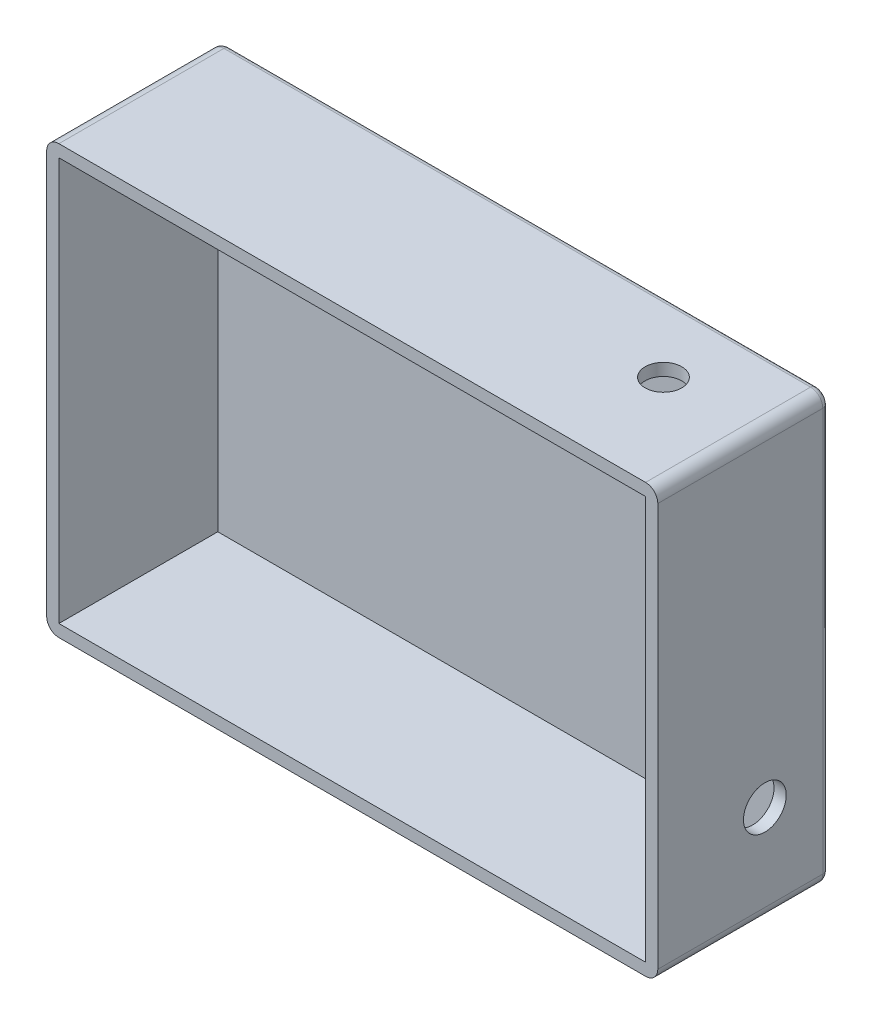
ISO-10303-21;
HEADER;
FILE_DESCRIPTION(('STEP AP214'),'2;1');
FILE_NAME('part.step','',(''),(''),'','','');
FILE_SCHEMA(('AUTOMOTIVE_DESIGN { 1 0 10303 214 1 1 1 1 }'));
ENDSEC;
DATA;
#1=APPLICATION_CONTEXT('core data for automotive mechanical design processes');
#2=APPLICATION_PROTOCOL_DEFINITION('international standard','automotive_design',2000,#1);
#3=PRODUCT_CONTEXT('',#1,'mechanical');
#4=PRODUCT('Part','Part','',(#3));
#5=PRODUCT_RELATED_PRODUCT_CATEGORY('part','',(#4));
#6=PRODUCT_DEFINITION_FORMATION('','',#4);
#7=PRODUCT_DEFINITION_CONTEXT('part definition',#1,'design');
#8=PRODUCT_DEFINITION('design','',#6,#7);
#9=PRODUCT_DEFINITION_SHAPE('','',#8);
#10=(LENGTH_UNIT() NAMED_UNIT(*) SI_UNIT(.MILLI.,.METRE.));
#11=(NAMED_UNIT(*) PLANE_ANGLE_UNIT() SI_UNIT($,.RADIAN.));
#12=(NAMED_UNIT(*) SI_UNIT($,.STERADIAN.) SOLID_ANGLE_UNIT());
#13=UNCERTAINTY_MEASURE_WITH_UNIT(LENGTH_MEASURE(1.E-05),#10,'distance_accuracy_value','');
#14=(GEOMETRIC_REPRESENTATION_CONTEXT(3) GLOBAL_UNCERTAINTY_ASSIGNED_CONTEXT((#13)) GLOBAL_UNIT_ASSIGNED_CONTEXT((#10,
#11,#12)) REPRESENTATION_CONTEXT('',''));
#15=CARTESIAN_POINT('',(0.,0.,0.));
#16=DIRECTION('',(0.,0.,1.));
#17=DIRECTION('',(1.,0.,0.));
#18=AXIS2_PLACEMENT_3D('',#15,#16,#17);
#19=CARTESIAN_POINT('',(250.,175.,140.));
#20=DIRECTION('',(-1.,0.,0.));
#21=DIRECTION('',(0.,-1.,0.));
#22=AXIS2_PLACEMENT_3D('',#19,#20,#21);
#23=PLANE('',#22);
#24=CARTESIAN_POINT('',(250.,-94.1040003709782,52.4033170038006));
#25=DIRECTION('',(1.,0.,0.));
#26=DIRECTION('',(0.,1.,0.));
#27=AXIS2_PLACEMENT_3D('',#24,#25,#26);
#28=CIRCLE('',#27,17.5);
#29=CARTESIAN_POINT('',(250.,-76.6040003709782,52.4033170038006));
#30=VERTEX_POINT('',#29);
#31=EDGE_CURVE('E202',#30,#30,#28,.T.);
#32=ORIENTED_EDGE('',*,*,#31,.F.);
#33=EDGE_LOOP('',(#32));
#34=FACE_BOUND('',#33,.T.);
#35=DIRECTION('',(0.,0.,-1.));
#36=VECTOR('',#35,1.);
#37=CARTESIAN_POINT('',(250.,-165.,140.));
#38=LINE('',#37,#36);
#39=CARTESIAN_POINT('',(250.,-165.,140.));
#40=VERTEX_POINT('',#39);
#41=CARTESIAN_POINT('',(250.,-165.,5.));
#42=VERTEX_POINT('',#41);
#43=EDGE_CURVE('E221',#40,#42,#38,.T.);
#44=ORIENTED_EDGE('',*,*,#43,.T.);
#45=DIRECTION('',(0.,1.,0.));
#46=VECTOR('',#45,1.);
#47=CARTESIAN_POINT('',(250.,175.,5.));
#48=LINE('',#47,#46);
#49=CARTESIAN_POINT('',(250.,165.,5.));
#50=VERTEX_POINT('',#49);
#51=EDGE_CURVE('E263',#42,#50,#48,.T.);
#52=ORIENTED_EDGE('',*,*,#51,.T.);
#53=DIRECTION('',(0.,0.,-1.));
#54=VECTOR('',#53,1.);
#55=CARTESIAN_POINT('',(250.,165.,140.));
#56=LINE('',#55,#54);
#57=CARTESIAN_POINT('',(250.,165.,140.));
#58=VERTEX_POINT('',#57);
#59=EDGE_CURVE('E224',#50,#58,#56,.F.);
#60=ORIENTED_EDGE('',*,*,#59,.T.);
#61=DIRECTION('',(0.,1.,0.));
#62=VECTOR('',#61,1.);
#63=CARTESIAN_POINT('',(250.,175.,140.));
#64=LINE('',#63,#62);
#65=EDGE_CURVE('E205',#40,#58,#64,.T.);
#66=ORIENTED_EDGE('',*,*,#65,.F.);
#67=EDGE_LOOP('',(#44,#52,#60,#66));
#68=FACE_BOUND('',#67,.T.);
#69=ADVANCED_FACE('F35',(#34,#68),#23,.F.);
#70=CARTESIAN_POINT('',(-250.,175.,140.));
#71=DIRECTION('',(0.,-1.,0.));
#72=DIRECTION('',(0.,0.,-1.));
#73=AXIS2_PLACEMENT_3D('',#70,#71,#72);
#74=PLANE('',#73);
#75=CARTESIAN_POINT('',(172.86422889253,175.,58.2460868735127));
#76=DIRECTION('',(0.,1.,0.));
#77=DIRECTION('',(0.,0.,1.));
#78=AXIS2_PLACEMENT_3D('',#75,#76,#77);
#79=CIRCLE('',#78,15.);
#80=CARTESIAN_POINT('',(172.86422889253,175.,73.2460868735127));
#81=VERTEX_POINT('',#80);
#82=EDGE_CURVE('E199',#81,#81,#79,.T.);
#83=ORIENTED_EDGE('',*,*,#82,.F.);
#84=EDGE_LOOP('',(#83));
#85=FACE_BOUND('',#84,.T.);
#86=DIRECTION('',(0.,0.,-1.));
#87=VECTOR('',#86,1.);
#88=CARTESIAN_POINT('',(240.,175.,140.));
#89=LINE('',#88,#87);
#90=CARTESIAN_POINT('',(240.,175.,140.));
#91=VERTEX_POINT('',#90);
#92=CARTESIAN_POINT('',(240.,175.,5.));
#93=VERTEX_POINT('',#92);
#94=EDGE_CURVE('E219',#91,#93,#89,.T.);
#95=ORIENTED_EDGE('',*,*,#94,.T.);
#96=DIRECTION('',(-1.,0.,0.));
#97=VECTOR('',#96,1.);
#98=CARTESIAN_POINT('',(-250.,175.,5.));
#99=LINE('',#98,#97);
#100=CARTESIAN_POINT('',(-240.,175.,5.));
#101=VERTEX_POINT('',#100);
#102=EDGE_CURVE('E11',#93,#101,#99,.T.);
#103=ORIENTED_EDGE('',*,*,#102,.T.);
#104=DIRECTION('',(0.,0.,-1.));
#105=VECTOR('',#104,1.);
#106=CARTESIAN_POINT('',(-240.,175.,140.));
#107=LINE('',#106,#105);
#108=CARTESIAN_POINT('',(-240.,175.,140.));
#109=VERTEX_POINT('',#108);
#110=EDGE_CURVE('E217',#101,#109,#107,.F.);
#111=ORIENTED_EDGE('',*,*,#110,.T.);
#112=DIRECTION('',(-1.,0.,0.));
#113=VECTOR('',#112,1.);
#114=CARTESIAN_POINT('',(-250.,175.,140.));
#115=LINE('',#114,#113);
#116=EDGE_CURVE('E208',#91,#109,#115,.T.);
#117=ORIENTED_EDGE('',*,*,#116,.F.);
#118=EDGE_LOOP('',(#95,#103,#111,#117));
#119=FACE_BOUND('',#118,.T.);
#120=ADVANCED_FACE('F344',(#85,#119),#74,.F.);
#121=CARTESIAN_POINT('',(-250.,175.,140.));
#122=DIRECTION('',(1.,0.,0.));
#123=DIRECTION('',(0.,0.,-1.));
#124=AXIS2_PLACEMENT_3D('',#121,#122,#123);
#125=PLANE('',#124);
#126=DIRECTION('',(0.,0.,-1.));
#127=VECTOR('',#126,1.);
#128=CARTESIAN_POINT('',(-250.,165.,140.));
#129=LINE('',#128,#127);
#130=CARTESIAN_POINT('',(-250.,165.,140.));
#131=VERTEX_POINT('',#130);
#132=CARTESIAN_POINT('',(-250.,165.,5.));
#133=VERTEX_POINT('',#132);
#134=EDGE_CURVE('E241',#131,#133,#129,.T.);
#135=ORIENTED_EDGE('',*,*,#134,.T.);
#136=DIRECTION('',(0.,-1.,0.));
#137=VECTOR('',#136,1.);
#138=CARTESIAN_POINT('',(-250.,175.,5.));
#139=LINE('',#138,#137);
#140=CARTESIAN_POINT('',(-250.,-165.,5.));
#141=VERTEX_POINT('',#140);
#142=EDGE_CURVE('E271',#133,#141,#139,.T.);
#143=ORIENTED_EDGE('',*,*,#142,.T.);
#144=DIRECTION('',(0.,0.,-1.));
#145=VECTOR('',#144,1.);
#146=CARTESIAN_POINT('',(-250.,-165.,140.));
#147=LINE('',#146,#145);
#148=CARTESIAN_POINT('',(-250.,-165.,140.));
#149=VERTEX_POINT('',#148);
#150=EDGE_CURVE('E239',#141,#149,#147,.F.);
#151=ORIENTED_EDGE('',*,*,#150,.T.);
#152=DIRECTION('',(0.,-1.,0.));
#153=VECTOR('',#152,1.);
#154=CARTESIAN_POINT('',(-250.,175.,140.));
#155=LINE('',#154,#153);
#156=EDGE_CURVE('E211',#131,#149,#155,.T.);
#157=ORIENTED_EDGE('',*,*,#156,.F.);
#158=EDGE_LOOP('',(#135,#143,#151,#157));
#159=FACE_BOUND('',#158,.T.);
#160=ADVANCED_FACE('F349',(#159),#125,.F.);
#161=CARTESIAN_POINT('',(-250.,-175.,140.));
#162=DIRECTION('',(0.,1.,0.));
#163=DIRECTION('',(0.,0.,1.));
#164=AXIS2_PLACEMENT_3D('',#161,#162,#163);
#165=PLANE('',#164);
#166=DIRECTION('',(0.,0.,-1.));
#167=VECTOR('',#166,1.);
#168=CARTESIAN_POINT('',(-240.,-175.,140.));
#169=LINE('',#168,#167);
#170=CARTESIAN_POINT('',(-240.,-175.,140.));
#171=VERTEX_POINT('',#170);
#172=CARTESIAN_POINT('',(-240.,-175.,5.));
#173=VERTEX_POINT('',#172);
#174=EDGE_CURVE('E234',#171,#173,#169,.T.);
#175=ORIENTED_EDGE('',*,*,#174,.T.);
#176=DIRECTION('',(1.,0.,0.));
#177=VECTOR('',#176,1.);
#178=CARTESIAN_POINT('',(-250.,-175.,5.));
#179=LINE('',#178,#177);
#180=CARTESIAN_POINT('',(240.,-175.,5.));
#181=VERTEX_POINT('',#180);
#182=EDGE_CURVE('E267',#173,#181,#179,.T.);
#183=ORIENTED_EDGE('',*,*,#182,.T.);
#184=DIRECTION('',(0.,0.,-1.));
#185=VECTOR('',#184,1.);
#186=CARTESIAN_POINT('',(240.,-175.,140.));
#187=LINE('',#186,#185);
#188=CARTESIAN_POINT('',(240.,-175.,140.));
#189=VERTEX_POINT('',#188);
#190=EDGE_CURVE('E237',#181,#189,#187,.F.);
#191=ORIENTED_EDGE('',*,*,#190,.T.);
#192=DIRECTION('',(1.,0.,0.));
#193=VECTOR('',#192,1.);
#194=CARTESIAN_POINT('',(-250.,-175.,140.));
#195=LINE('',#194,#193);
#196=EDGE_CURVE('E214',#171,#189,#195,.T.);
#197=ORIENTED_EDGE('',*,*,#196,.F.);
#198=EDGE_LOOP('',(#175,#183,#191,#197));
#199=FACE_BOUND('',#198,.T.);
#200=ADVANCED_FACE('F312',(#199),#165,.F.);
#201=CARTESIAN_POINT('',(0.,0.,140.));
#202=DIRECTION('',(0.,0.,1.));
#203=DIRECTION('',(1.,0.,0.));
#204=AXIS2_PLACEMENT_3D('',#201,#202,#203);
#205=PLANE('',#204);
#206=DIRECTION('',(0.,1.,0.));
#207=VECTOR('',#206,1.);
#208=CARTESIAN_POINT('',(240.,165.,140.));
#209=LINE('',#208,#207);
#210=CARTESIAN_POINT('',(240.,-165.,140.));
#211=VERTEX_POINT('',#210);
#212=CARTESIAN_POINT('',(240.,165.,140.));
#213=VERTEX_POINT('',#212);
#214=EDGE_CURVE('E157',#211,#213,#209,.T.);
#215=ORIENTED_EDGE('',*,*,#214,.F.);
#216=DIRECTION('',(1.,0.,0.));
#217=VECTOR('',#216,1.);
#218=CARTESIAN_POINT('',(-240.,-165.,140.));
#219=LINE('',#218,#217);
#220=CARTESIAN_POINT('',(-240.,-165.,140.));
#221=VERTEX_POINT('',#220);
#222=EDGE_CURVE('E175',#221,#211,#219,.T.);
#223=ORIENTED_EDGE('',*,*,#222,.F.);
#224=DIRECTION('',(0.,-1.,0.));
#225=VECTOR('',#224,1.);
#226=CARTESIAN_POINT('',(-240.,165.,140.));
#227=LINE('',#226,#225);
#228=CARTESIAN_POINT('',(-240.,165.,140.));
#229=VERTEX_POINT('',#228);
#230=EDGE_CURVE('E178',#229,#221,#227,.T.);
#231=ORIENTED_EDGE('',*,*,#230,.F.);
#232=DIRECTION('',(-1.,0.,0.));
#233=VECTOR('',#232,1.);
#234=CARTESIAN_POINT('',(-240.,165.,140.));
#235=LINE('',#234,#233);
#236=EDGE_CURVE('E184',#213,#229,#235,.T.);
#237=ORIENTED_EDGE('',*,*,#236,.F.);
#238=EDGE_LOOP('',(#215,#223,#231,#237));
#239=FACE_BOUND('',#238,.T.);
#240=ORIENTED_EDGE('',*,*,#65,.T.);
#241=CARTESIAN_POINT('',(240.,165.,140.));
#242=DIRECTION('',(0.,0.,1.));
#243=DIRECTION('',(1.,0.,0.));
#244=AXIS2_PLACEMENT_3D('',#241,#242,#243);
#245=CIRCLE('',#244,10.);
#246=EDGE_CURVE('E232',#58,#91,#245,.T.);
#247=ORIENTED_EDGE('',*,*,#246,.T.);
#248=ORIENTED_EDGE('',*,*,#116,.T.);
#249=CARTESIAN_POINT('',(-240.,165.,140.));
#250=DIRECTION('',(0.,0.,1.));
#251=DIRECTION('',(1.,0.,0.));
#252=AXIS2_PLACEMENT_3D('',#249,#250,#251);
#253=CIRCLE('',#252,10.);
#254=EDGE_CURVE('E228',#109,#131,#253,.T.);
#255=ORIENTED_EDGE('',*,*,#254,.T.);
#256=ORIENTED_EDGE('',*,*,#156,.T.);
#257=CARTESIAN_POINT('',(-240.,-165.,140.));
#258=DIRECTION('',(0.,0.,1.));
#259=DIRECTION('',(1.,0.,0.));
#260=AXIS2_PLACEMENT_3D('',#257,#258,#259);
#261=CIRCLE('',#260,10.);
#262=EDGE_CURVE('E226',#149,#171,#261,.T.);
#263=ORIENTED_EDGE('',*,*,#262,.T.);
#264=ORIENTED_EDGE('',*,*,#196,.T.);
#265=CARTESIAN_POINT('',(240.,-165.,140.));
#266=DIRECTION('',(0.,0.,1.));
#267=DIRECTION('',(1.,0.,0.));
#268=AXIS2_PLACEMENT_3D('',#265,#266,#267);
#269=CIRCLE('',#268,10.);
#270=EDGE_CURVE('E230',#189,#40,#269,.T.);
#271=ORIENTED_EDGE('',*,*,#270,.T.);
#272=EDGE_LOOP('',(#240,#247,#248,#255,#256,#263,#264,#271));
#273=FACE_BOUND('',#272,.T.);
#274=ADVANCED_FACE('F316',(#239,#273),#205,.T.);
#275=CARTESIAN_POINT('',(0.,0.,0.));
#276=DIRECTION('',(0.,0.,1.));
#277=DIRECTION('',(1.,0.,0.));
#278=AXIS2_PLACEMENT_3D('',#275,#276,#277);
#279=PLANE('',#278);
#280=DIRECTION('',(-1.,0.,0.));
#281=VECTOR('',#280,1.);
#282=CARTESIAN_POINT('',(0.,170.,0.));
#283=LINE('',#282,#281);
#284=CARTESIAN_POINT('',(-240.,170.,0.));
#285=VERTEX_POINT('',#284);
#286=CARTESIAN_POINT('',(240.,170.,0.));
#287=VERTEX_POINT('',#286);
#288=EDGE_CURVE('E243',#285,#287,#283,.F.);
#289=ORIENTED_EDGE('',*,*,#288,.T.);
#290=CARTESIAN_POINT('',(240.,165.,0.));
#291=DIRECTION('',(0.,0.,1.));
#292=DIRECTION('',(1.,0.,0.));
#293=AXIS2_PLACEMENT_3D('',#290,#291,#292);
#294=CIRCLE('',#293,5.);
#295=CARTESIAN_POINT('',(245.,165.,0.));
#296=VERTEX_POINT('',#295);
#297=EDGE_CURVE('E257',#287,#296,#294,.F.);
#298=ORIENTED_EDGE('',*,*,#297,.T.);
#299=DIRECTION('',(0.,1.,0.));
#300=VECTOR('',#299,1.);
#301=CARTESIAN_POINT('',(245.,0.,0.));
#302=LINE('',#301,#300);
#303=CARTESIAN_POINT('',(245.,-165.,0.));
#304=VERTEX_POINT('',#303);
#305=EDGE_CURVE('E255',#296,#304,#302,.F.);
#306=ORIENTED_EDGE('',*,*,#305,.T.);
#307=CARTESIAN_POINT('',(240.,-165.,0.));
#308=DIRECTION('',(0.,0.,1.));
#309=DIRECTION('',(1.,0.,0.));
#310=AXIS2_PLACEMENT_3D('',#307,#308,#309);
#311=CIRCLE('',#310,5.);
#312=CARTESIAN_POINT('',(240.,-170.,0.));
#313=VERTEX_POINT('',#312);
#314=EDGE_CURVE('E253',#304,#313,#311,.F.);
#315=ORIENTED_EDGE('',*,*,#314,.T.);
#316=DIRECTION('',(1.,0.,0.));
#317=VECTOR('',#316,1.);
#318=CARTESIAN_POINT('',(0.,-170.,0.));
#319=LINE('',#318,#317);
#320=CARTESIAN_POINT('',(-240.,-170.,0.));
#321=VERTEX_POINT('',#320);
#322=EDGE_CURVE('E251',#313,#321,#319,.F.);
#323=ORIENTED_EDGE('',*,*,#322,.T.);
#324=CARTESIAN_POINT('',(-240.,-165.,0.));
#325=DIRECTION('',(0.,0.,1.));
#326=DIRECTION('',(1.,0.,0.));
#327=AXIS2_PLACEMENT_3D('',#324,#325,#326);
#328=CIRCLE('',#327,5.);
#329=CARTESIAN_POINT('',(-245.,-165.,0.));
#330=VERTEX_POINT('',#329);
#331=EDGE_CURVE('E249',#321,#330,#328,.F.);
#332=ORIENTED_EDGE('',*,*,#331,.T.);
#333=DIRECTION('',(0.,-1.,0.));
#334=VECTOR('',#333,1.);
#335=CARTESIAN_POINT('',(-245.,0.,0.));
#336=LINE('',#335,#334);
#337=CARTESIAN_POINT('',(-245.,165.,0.));
#338=VERTEX_POINT('',#337);
#339=EDGE_CURVE('E247',#330,#338,#336,.F.);
#340=ORIENTED_EDGE('',*,*,#339,.T.);
#341=CARTESIAN_POINT('',(-240.,165.,0.));
#342=DIRECTION('',(0.,0.,1.));
#343=DIRECTION('',(1.,0.,0.));
#344=AXIS2_PLACEMENT_3D('',#341,#342,#343);
#345=CIRCLE('',#344,5.);
#346=EDGE_CURVE('E245',#338,#285,#345,.F.);
#347=ORIENTED_EDGE('',*,*,#346,.T.);
#348=EDGE_LOOP('',(#289,#298,#306,#315,#323,#332,#340,#347));
#349=FACE_BOUND('',#348,.T.);
#350=ADVANCED_FACE('F463',(#349),#279,.F.);
#351=CARTESIAN_POINT('',(240.,-94.1040003709782,52.4033170038006));
#352=DIRECTION('',(1.,0.,0.));
#353=DIRECTION('',(0.,1.,0.));
#354=AXIS2_PLACEMENT_3D('',#351,#352,#353);
#355=CYLINDRICAL_SURFACE('',#354,17.5);
#356=CARTESIAN_POINT('',(240.,-94.1040003709782,52.4033170038006));
#357=DIRECTION('',(1.,0.,0.));
#358=DIRECTION('',(0.,0.,-1.));
#359=AXIS2_PLACEMENT_3D('',#356,#357,#358);
#360=CIRCLE('',#359,17.5);
#361=CARTESIAN_POINT('',(240.,-94.1040003709782,34.9033170038006));
#362=VERTEX_POINT('',#361);
#363=EDGE_CURVE('E196',#362,#362,#360,.F.);
#364=ORIENTED_EDGE('',*,*,#363,.T.);
#365=EDGE_LOOP('',(#364));
#366=FACE_BOUND('',#365,.T.);
#367=ORIENTED_EDGE('',*,*,#31,.T.);
#368=EDGE_LOOP('',(#367));
#369=FACE_BOUND('',#368,.T.);
#370=ADVANCED_FACE('F455',(#366,#369),#355,.F.);
#371=CARTESIAN_POINT('',(172.86422889253,165.,58.2460868735127));
#372=DIRECTION('',(0.,1.,0.));
#373=DIRECTION('',(0.,0.,1.));
#374=AXIS2_PLACEMENT_3D('',#371,#372,#373);
#375=CYLINDRICAL_SURFACE('',#374,15.);
#376=CARTESIAN_POINT('',(172.86422889253,165.,58.2460868735127));
#377=DIRECTION('',(0.,1.,0.));
#378=DIRECTION('',(0.,0.,1.));
#379=AXIS2_PLACEMENT_3D('',#376,#377,#378);
#380=CIRCLE('',#379,15.);
#381=CARTESIAN_POINT('',(172.86422889253,165.,73.2460868735127));
#382=VERTEX_POINT('',#381);
#383=EDGE_CURVE('E190',#382,#382,#380,.F.);
#384=ORIENTED_EDGE('',*,*,#383,.T.);
#385=EDGE_LOOP('',(#384));
#386=FACE_BOUND('',#385,.T.);
#387=ORIENTED_EDGE('',*,*,#82,.T.);
#388=EDGE_LOOP('',(#387));
#389=FACE_BOUND('',#388,.T.);
#390=ADVANCED_FACE('F448',(#386,#389),#375,.F.);
#391=CARTESIAN_POINT('',(240.,165.,10.));
#392=DIRECTION('',(1.,0.,0.));
#393=DIRECTION('',(0.,0.,-1.));
#394=AXIS2_PLACEMENT_3D('',#391,#392,#393);
#395=PLANE('',#394);
#396=ORIENTED_EDGE('',*,*,#214,.T.);
#397=DIRECTION('',(0.,0.,1.));
#398=VECTOR('',#397,1.);
#399=CARTESIAN_POINT('',(240.,165.,10.));
#400=LINE('',#399,#398);
#401=CARTESIAN_POINT('',(240.,165.,10.));
#402=VERTEX_POINT('',#401);
#403=EDGE_CURVE('E149',#402,#213,#400,.T.);
#404=ORIENTED_EDGE('',*,*,#403,.F.);
#405=DIRECTION('',(0.,1.,0.));
#406=VECTOR('',#405,1.);
#407=CARTESIAN_POINT('',(240.,165.,10.));
#408=LINE('',#407,#406);
#409=CARTESIAN_POINT('',(240.,-165.,10.));
#410=VERTEX_POINT('',#409);
#411=EDGE_CURVE('E154',#410,#402,#408,.T.);
#412=ORIENTED_EDGE('',*,*,#411,.F.);
#413=DIRECTION('',(0.,0.,1.));
#414=VECTOR('',#413,1.);
#415=CARTESIAN_POINT('',(240.,-165.,10.));
#416=LINE('',#415,#414);
#417=EDGE_CURVE('E188',#410,#211,#416,.T.);
#418=ORIENTED_EDGE('',*,*,#417,.T.);
#419=EDGE_LOOP('',(#396,#404,#412,#418));
#420=FACE_BOUND('',#419,.T.);
#421=ORIENTED_EDGE('',*,*,#363,.F.);
#422=EDGE_LOOP('',(#421));
#423=FACE_BOUND('',#422,.T.);
#424=ADVANCED_FACE('F151',(#420,#423),#395,.F.);
#425=CARTESIAN_POINT('',(-240.,165.,10.));
#426=DIRECTION('',(0.,1.,0.));
#427=DIRECTION('',(0.,0.,1.));
#428=AXIS2_PLACEMENT_3D('',#425,#426,#427);
#429=PLANE('',#428);
#430=ORIENTED_EDGE('',*,*,#236,.T.);
#431=DIRECTION('',(0.,0.,1.));
#432=VECTOR('',#431,1.);
#433=CARTESIAN_POINT('',(-240.,165.,10.));
#434=LINE('',#433,#432);
#435=CARTESIAN_POINT('',(-240.,165.,10.));
#436=VERTEX_POINT('',#435);
#437=EDGE_CURVE('E161',#436,#229,#434,.T.);
#438=ORIENTED_EDGE('',*,*,#437,.F.);
#439=DIRECTION('',(-1.,0.,0.));
#440=VECTOR('',#439,1.);
#441=CARTESIAN_POINT('',(-240.,165.,10.));
#442=LINE('',#441,#440);
#443=EDGE_CURVE('E165',#402,#436,#442,.T.);
#444=ORIENTED_EDGE('',*,*,#443,.F.);
#445=ORIENTED_EDGE('',*,*,#403,.T.);
#446=EDGE_LOOP('',(#430,#438,#444,#445));
#447=FACE_BOUND('',#446,.T.);
#448=ORIENTED_EDGE('',*,*,#383,.F.);
#449=EDGE_LOOP('',(#448));
#450=FACE_BOUND('',#449,.T.);
#451=ADVANCED_FACE('F166',(#447,#450),#429,.F.);
#452=CARTESIAN_POINT('',(-240.,-165.,10.));
#453=DIRECTION('',(0.,-1.,0.));
#454=DIRECTION('',(0.,0.,-1.));
#455=AXIS2_PLACEMENT_3D('',#452,#453,#454);
#456=PLANE('',#455);
#457=ORIENTED_EDGE('',*,*,#222,.T.);
#458=ORIENTED_EDGE('',*,*,#417,.F.);
#459=DIRECTION('',(1.,0.,0.));
#460=VECTOR('',#459,1.);
#461=CARTESIAN_POINT('',(-240.,-165.,10.));
#462=LINE('',#461,#460);
#463=CARTESIAN_POINT('',(-240.,-165.,10.));
#464=VERTEX_POINT('',#463);
#465=EDGE_CURVE('E162',#464,#410,#462,.T.);
#466=ORIENTED_EDGE('',*,*,#465,.F.);
#467=DIRECTION('',(0.,0.,1.));
#468=VECTOR('',#467,1.);
#469=CARTESIAN_POINT('',(-240.,-165.,10.));
#470=LINE('',#469,#468);
#471=EDGE_CURVE('E191',#464,#221,#470,.T.);
#472=ORIENTED_EDGE('',*,*,#471,.T.);
#473=EDGE_LOOP('',(#457,#458,#466,#472));
#474=FACE_BOUND('',#473,.T.);
#475=ADVANCED_FACE('F427',(#474),#456,.F.);
#476=CARTESIAN_POINT('',(-240.,165.,10.));
#477=DIRECTION('',(-1.,0.,0.));
#478=DIRECTION('',(0.,0.,1.));
#479=AXIS2_PLACEMENT_3D('',#476,#477,#478);
#480=PLANE('',#479);
#481=ORIENTED_EDGE('',*,*,#230,.T.);
#482=ORIENTED_EDGE('',*,*,#471,.F.);
#483=DIRECTION('',(0.,-1.,0.));
#484=VECTOR('',#483,1.);
#485=CARTESIAN_POINT('',(-240.,165.,10.));
#486=LINE('',#485,#484);
#487=EDGE_CURVE('E171',#436,#464,#486,.T.);
#488=ORIENTED_EDGE('',*,*,#487,.F.);
#489=ORIENTED_EDGE('',*,*,#437,.T.);
#490=EDGE_LOOP('',(#481,#482,#488,#489));
#491=FACE_BOUND('',#490,.T.);
#492=ADVANCED_FACE('F419',(#491),#480,.F.);
#493=CARTESIAN_POINT('',(0.,0.,10.));
#494=DIRECTION('',(0.,0.,1.));
#495=DIRECTION('',(1.,0.,0.));
#496=AXIS2_PLACEMENT_3D('',#493,#494,#495);
#497=PLANE('',#496);
#498=ORIENTED_EDGE('',*,*,#411,.T.);
#499=ORIENTED_EDGE('',*,*,#443,.T.);
#500=ORIENTED_EDGE('',*,*,#487,.T.);
#501=ORIENTED_EDGE('',*,*,#465,.T.);
#502=EDGE_LOOP('',(#498,#499,#500,#501));
#503=FACE_BOUND('',#502,.T.);
#504=ADVANCED_FACE('F173',(#503),#497,.T.);
#505=CARTESIAN_POINT('',(240.,165.,140.));
#506=DIRECTION('',(0.,0.,-1.));
#507=DIRECTION('',(-1.,0.,0.));
#508=AXIS2_PLACEMENT_3D('',#505,#506,#507);
#509=CYLINDRICAL_SURFACE('',#508,10.);
#510=ORIENTED_EDGE('',*,*,#59,.F.);
#511=CARTESIAN_POINT('',(240.,165.,5.));
#512=DIRECTION('',(0.,0.,1.));
#513=DIRECTION('',(1.,0.,0.));
#514=AXIS2_PLACEMENT_3D('',#511,#512,#513);
#515=CIRCLE('',#514,10.);
#516=EDGE_CURVE('E260',#50,#93,#515,.T.);
#517=ORIENTED_EDGE('',*,*,#516,.T.);
#518=ORIENTED_EDGE('',*,*,#94,.F.);
#519=ORIENTED_EDGE('',*,*,#246,.F.);
#520=EDGE_LOOP('',(#510,#517,#518,#519));
#521=FACE_BOUND('',#520,.T.);
#522=ADVANCED_FACE('F341',(#521),#509,.T.);
#523=CARTESIAN_POINT('',(240.,-165.,140.));
#524=DIRECTION('',(0.,0.,-1.));
#525=DIRECTION('',(-1.,0.,0.));
#526=AXIS2_PLACEMENT_3D('',#523,#524,#525);
#527=CYLINDRICAL_SURFACE('',#526,10.);
#528=ORIENTED_EDGE('',*,*,#190,.F.);
#529=CARTESIAN_POINT('',(240.,-165.,5.));
#530=DIRECTION('',(0.,0.,1.));
#531=DIRECTION('',(1.,0.,0.));
#532=AXIS2_PLACEMENT_3D('',#529,#530,#531);
#533=CIRCLE('',#532,10.);
#534=EDGE_CURVE('E265',#181,#42,#533,.T.);
#535=ORIENTED_EDGE('',*,*,#534,.T.);
#536=ORIENTED_EDGE('',*,*,#43,.F.);
#537=ORIENTED_EDGE('',*,*,#270,.F.);
#538=EDGE_LOOP('',(#528,#535,#536,#537));
#539=FACE_BOUND('',#538,.T.);
#540=ADVANCED_FACE('F320',(#539),#527,.T.);
#541=CARTESIAN_POINT('',(-240.,165.,140.));
#542=DIRECTION('',(0.,0.,-1.));
#543=DIRECTION('',(-1.,0.,0.));
#544=AXIS2_PLACEMENT_3D('',#541,#542,#543);
#545=CYLINDRICAL_SURFACE('',#544,10.);
#546=ORIENTED_EDGE('',*,*,#110,.F.);
#547=CARTESIAN_POINT('',(-240.,165.,5.));
#548=DIRECTION('',(0.,0.,1.));
#549=DIRECTION('',(1.,0.,0.));
#550=AXIS2_PLACEMENT_3D('',#547,#548,#549);
#551=CIRCLE('',#550,10.);
#552=EDGE_CURVE('E44',#101,#133,#551,.T.);
#553=ORIENTED_EDGE('',*,*,#552,.T.);
#554=ORIENTED_EDGE('',*,*,#134,.F.);
#555=ORIENTED_EDGE('',*,*,#254,.F.);
#556=EDGE_LOOP('',(#546,#553,#554,#555));
#557=FACE_BOUND('',#556,.T.);
#558=ADVANCED_FACE('F347',(#557),#545,.T.);
#559=CARTESIAN_POINT('',(-240.,-165.,140.));
#560=DIRECTION('',(0.,0.,-1.));
#561=DIRECTION('',(-1.,0.,0.));
#562=AXIS2_PLACEMENT_3D('',#559,#560,#561);
#563=CYLINDRICAL_SURFACE('',#562,10.);
#564=ORIENTED_EDGE('',*,*,#150,.F.);
#565=CARTESIAN_POINT('',(-240.,-165.,5.));
#566=DIRECTION('',(0.,0.,1.));
#567=DIRECTION('',(1.,0.,0.));
#568=AXIS2_PLACEMENT_3D('',#565,#566,#567);
#569=CIRCLE('',#568,10.);
#570=EDGE_CURVE('E269',#141,#173,#569,.T.);
#571=ORIENTED_EDGE('',*,*,#570,.T.);
#572=ORIENTED_EDGE('',*,*,#174,.F.);
#573=ORIENTED_EDGE('',*,*,#262,.F.);
#574=EDGE_LOOP('',(#564,#571,#572,#573));
#575=FACE_BOUND('',#574,.T.);
#576=ADVANCED_FACE('F308',(#575),#563,.T.);
#577=CARTESIAN_POINT('',(-240.,-165.,5.));
#578=DIRECTION('',(0.,0.,1.));
#579=DIRECTION('',(1.,0.,0.));
#580=AXIS2_PLACEMENT_3D('',#577,#578,#579);
#581=DEGENERATE_TOROIDAL_SURFACE('',#580,5.,5.,.T.);
#582=CARTESIAN_POINT('',(-240.,-170.,5.));
#583=DIRECTION('',(1.,0.,0.));
#584=DIRECTION('',(0.,0.,-1.));
#585=AXIS2_PLACEMENT_3D('',#582,#583,#584);
#586=CIRCLE('',#585,5.);
#587=EDGE_CURVE('E289',#173,#321,#586,.T.);
#588=ORIENTED_EDGE('',*,*,#587,.F.);
#589=ORIENTED_EDGE('',*,*,#570,.F.);
#590=CARTESIAN_POINT('',(-245.,-165.,5.));
#591=DIRECTION('',(0.,1.,0.));
#592=DIRECTION('',(0.,0.,1.));
#593=AXIS2_PLACEMENT_3D('',#590,#591,#592);
#594=CIRCLE('',#593,5.);
#595=EDGE_CURVE('E39',#330,#141,#594,.T.);
#596=ORIENTED_EDGE('',*,*,#595,.F.);
#597=ORIENTED_EDGE('',*,*,#331,.F.);
#598=EDGE_LOOP('',(#588,#589,#596,#597));
#599=FACE_BOUND('',#598,.T.);
#600=ADVANCED_FACE('F37',(#599),#581,.T.);
#601=CARTESIAN_POINT('',(-245.,175.,5.));
#602=DIRECTION('',(0.,-1.,0.));
#603=DIRECTION('',(0.,0.,-1.));
#604=AXIS2_PLACEMENT_3D('',#601,#602,#603);
#605=CYLINDRICAL_SURFACE('',#604,5.);
#606=ORIENTED_EDGE('',*,*,#595,.T.);
#607=ORIENTED_EDGE('',*,*,#142,.F.);
#608=CARTESIAN_POINT('',(-245.,165.,5.));
#609=DIRECTION('',(0.,1.,0.));
#610=DIRECTION('',(0.,0.,1.));
#611=AXIS2_PLACEMENT_3D('',#608,#609,#610);
#612=CIRCLE('',#611,5.);
#613=EDGE_CURVE('E287',#338,#133,#612,.T.);
#614=ORIENTED_EDGE('',*,*,#613,.F.);
#615=ORIENTED_EDGE('',*,*,#339,.F.);
#616=EDGE_LOOP('',(#606,#607,#614,#615));
#617=FACE_BOUND('',#616,.T.);
#618=ADVANCED_FACE('F300',(#617),#605,.T.);
#619=CARTESIAN_POINT('',(-250.,-170.,5.));
#620=DIRECTION('',(1.,0.,0.));
#621=DIRECTION('',(0.,0.,-1.));
#622=AXIS2_PLACEMENT_3D('',#619,#620,#621);
#623=CYLINDRICAL_SURFACE('',#622,5.);
#624=ORIENTED_EDGE('',*,*,#587,.T.);
#625=ORIENTED_EDGE('',*,*,#322,.F.);
#626=CARTESIAN_POINT('',(240.,-170.,5.));
#627=DIRECTION('',(1.,0.,0.));
#628=DIRECTION('',(0.,0.,-1.));
#629=AXIS2_PLACEMENT_3D('',#626,#627,#628);
#630=CIRCLE('',#629,5.);
#631=EDGE_CURVE('E284',#181,#313,#630,.T.);
#632=ORIENTED_EDGE('',*,*,#631,.F.);
#633=ORIENTED_EDGE('',*,*,#182,.F.);
#634=EDGE_LOOP('',(#624,#625,#632,#633));
#635=FACE_BOUND('',#634,.T.);
#636=ADVANCED_FACE('F387',(#635),#623,.T.);
#637=CARTESIAN_POINT('',(-240.,165.,5.));
#638=DIRECTION('',(0.,0.,1.));
#639=DIRECTION('',(1.,0.,0.));
#640=AXIS2_PLACEMENT_3D('',#637,#638,#639);
#641=DEGENERATE_TOROIDAL_SURFACE('',#640,5.,5.,.T.);
#642=ORIENTED_EDGE('',*,*,#613,.T.);
#643=ORIENTED_EDGE('',*,*,#552,.F.);
#644=CARTESIAN_POINT('',(-240.,170.,5.));
#645=DIRECTION('',(1.,0.,0.));
#646=DIRECTION('',(0.,0.,-1.));
#647=AXIS2_PLACEMENT_3D('',#644,#645,#646);
#648=CIRCLE('',#647,5.);
#649=EDGE_CURVE('E281',#285,#101,#648,.T.);
#650=ORIENTED_EDGE('',*,*,#649,.F.);
#651=ORIENTED_EDGE('',*,*,#346,.F.);
#652=EDGE_LOOP('',(#642,#643,#650,#651));
#653=FACE_BOUND('',#652,.T.);
#654=ADVANCED_FACE('F384',(#653),#641,.T.);
#655=CARTESIAN_POINT('',(240.,-165.,5.));
#656=DIRECTION('',(0.,0.,1.));
#657=DIRECTION('',(1.,0.,0.));
#658=AXIS2_PLACEMENT_3D('',#655,#656,#657);
#659=DEGENERATE_TOROIDAL_SURFACE('',#658,5.,5.,.T.);
#660=ORIENTED_EDGE('',*,*,#631,.T.);
#661=ORIENTED_EDGE('',*,*,#314,.F.);
#662=CARTESIAN_POINT('',(245.,-165.,5.));
#663=DIRECTION('',(0.,1.,0.));
#664=DIRECTION('',(0.,0.,1.));
#665=AXIS2_PLACEMENT_3D('',#662,#663,#664);
#666=CIRCLE('',#665,5.);
#667=EDGE_CURVE('E278',#42,#304,#666,.T.);
#668=ORIENTED_EDGE('',*,*,#667,.F.);
#669=ORIENTED_EDGE('',*,*,#534,.F.);
#670=EDGE_LOOP('',(#660,#661,#668,#669));
#671=FACE_BOUND('',#670,.T.);
#672=ADVANCED_FACE('F329',(#671),#659,.T.);
#673=CARTESIAN_POINT('',(-250.,170.,5.));
#674=DIRECTION('',(-1.,0.,0.));
#675=DIRECTION('',(0.,0.,1.));
#676=AXIS2_PLACEMENT_3D('',#673,#674,#675);
#677=CYLINDRICAL_SURFACE('',#676,5.);
#678=ORIENTED_EDGE('',*,*,#649,.T.);
#679=ORIENTED_EDGE('',*,*,#102,.F.);
#680=CARTESIAN_POINT('',(240.,170.,5.));
#681=DIRECTION('',(1.,0.,0.));
#682=DIRECTION('',(0.,0.,-1.));
#683=AXIS2_PLACEMENT_3D('',#680,#681,#682);
#684=CIRCLE('',#683,5.);
#685=EDGE_CURVE('E276',#287,#93,#684,.T.);
#686=ORIENTED_EDGE('',*,*,#685,.F.);
#687=ORIENTED_EDGE('',*,*,#288,.F.);
#688=EDGE_LOOP('',(#678,#679,#686,#687));
#689=FACE_BOUND('',#688,.T.);
#690=ADVANCED_FACE('F378',(#689),#677,.T.);
#691=CARTESIAN_POINT('',(245.,175.,5.));
#692=DIRECTION('',(0.,1.,0.));
#693=DIRECTION('',(-1.,0.,0.));
#694=AXIS2_PLACEMENT_3D('',#691,#692,#693);
#695=CYLINDRICAL_SURFACE('',#694,5.);
#696=ORIENTED_EDGE('',*,*,#667,.T.);
#697=ORIENTED_EDGE('',*,*,#305,.F.);
#698=CARTESIAN_POINT('',(245.,165.,5.));
#699=DIRECTION('',(0.,1.,0.));
#700=DIRECTION('',(0.,0.,1.));
#701=AXIS2_PLACEMENT_3D('',#698,#699,#700);
#702=CIRCLE('',#701,5.);
#703=EDGE_CURVE('E274',#50,#296,#702,.T.);
#704=ORIENTED_EDGE('',*,*,#703,.F.);
#705=ORIENTED_EDGE('',*,*,#51,.F.);
#706=EDGE_LOOP('',(#696,#697,#704,#705));
#707=FACE_BOUND('',#706,.T.);
#708=ADVANCED_FACE('F333',(#707),#695,.T.);
#709=CARTESIAN_POINT('',(240.,165.,5.));
#710=DIRECTION('',(0.,0.,1.));
#711=DIRECTION('',(1.,0.,0.));
#712=AXIS2_PLACEMENT_3D('',#709,#710,#711);
#713=DEGENERATE_TOROIDAL_SURFACE('',#712,5.,5.,.T.);
#714=ORIENTED_EDGE('',*,*,#685,.T.);
#715=ORIENTED_EDGE('',*,*,#516,.F.);
#716=ORIENTED_EDGE('',*,*,#703,.T.);
#717=ORIENTED_EDGE('',*,*,#297,.F.);
#718=EDGE_LOOP('',(#714,#715,#716,#717));
#719=FACE_BOUND('',#718,.T.);
#720=ADVANCED_FACE('F337',(#719),#713,.T.);
#721=CLOSED_SHELL('',(#69,#120,#160,#200,#274,#350,#370,#390,#424,#451,#475,#492,#504,#522,#540,
#558,#576,#600,#618,#636,#654,#672,#690,#708,#720));
#722=MANIFOLD_SOLID_BREP('B2',#721);
#723=ADVANCED_BREP_SHAPE_REPRESENTATION('',(#18,#722),#14);
#724=SHAPE_DEFINITION_REPRESENTATION(#9,#723);
ENDSEC;
END-ISO-10303-21;
